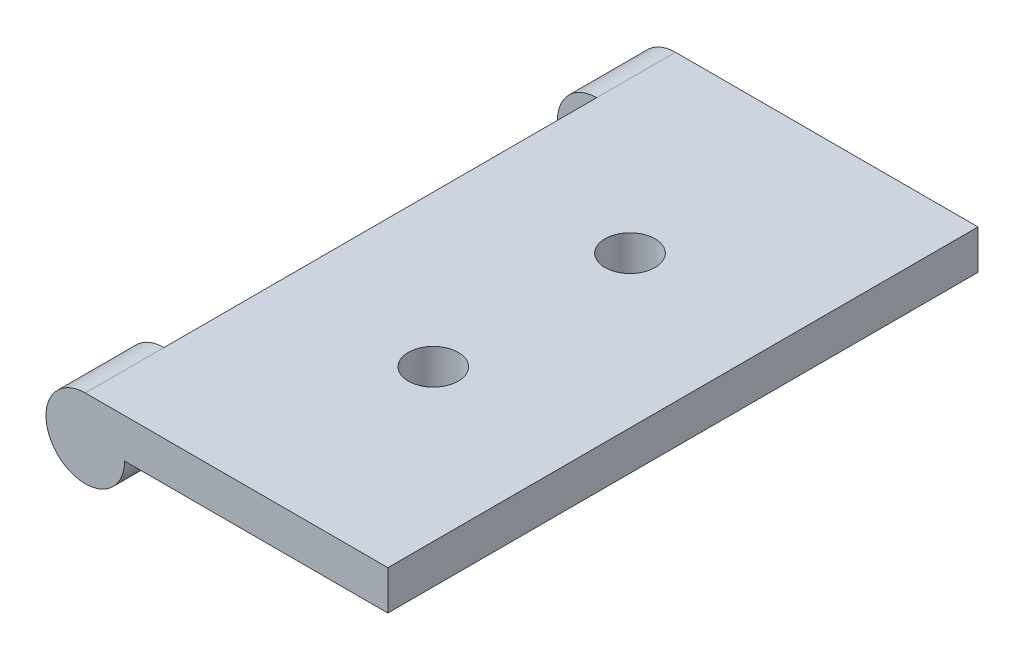
ISO-10303-21;
HEADER;
FILE_DESCRIPTION(('STEP AP214'),'2;1');
FILE_NAME('part.step','',(''),(''),'','','');
FILE_SCHEMA(('AUTOMOTIVE_DESIGN { 1 0 10303 214 1 1 1 1 }'));
ENDSEC;
DATA;
#1=APPLICATION_CONTEXT('core data for automotive mechanical design processes');
#2=APPLICATION_PROTOCOL_DEFINITION('international standard','automotive_design',2000,#1);
#3=PRODUCT_CONTEXT('',#1,'mechanical');
#4=PRODUCT('Part','Part','',(#3));
#5=PRODUCT_RELATED_PRODUCT_CATEGORY('part','',(#4));
#6=PRODUCT_DEFINITION_FORMATION('','',#4);
#7=PRODUCT_DEFINITION_CONTEXT('part definition',#1,'design');
#8=PRODUCT_DEFINITION('design','',#6,#7);
#9=PRODUCT_DEFINITION_SHAPE('','',#8);
#10=(LENGTH_UNIT() NAMED_UNIT(*) SI_UNIT(.MILLI.,.METRE.));
#11=(NAMED_UNIT(*) PLANE_ANGLE_UNIT() SI_UNIT($,.RADIAN.));
#12=(NAMED_UNIT(*) SI_UNIT($,.STERADIAN.) SOLID_ANGLE_UNIT());
#13=UNCERTAINTY_MEASURE_WITH_UNIT(LENGTH_MEASURE(1.E-05),#10,'distance_accuracy_value','');
#14=(GEOMETRIC_REPRESENTATION_CONTEXT(3) GLOBAL_UNCERTAINTY_ASSIGNED_CONTEXT((#13)) GLOBAL_UNIT_ASSIGNED_CONTEXT((#10,
#11,#12)) REPRESENTATION_CONTEXT('',''));
#15=CARTESIAN_POINT('',(0.,0.,0.));
#16=DIRECTION('',(0.,0.,1.));
#17=DIRECTION('',(1.,0.,0.));
#18=AXIS2_PLACEMENT_3D('',#15,#16,#17);
#19=CARTESIAN_POINT('',(44.2264973081033,0.,-75.));
#20=DIRECTION('',(0.,1.,0.));
#21=DIRECTION('',(-1.,0.,0.));
#22=AXIS2_PLACEMENT_3D('',#19,#20,#21);
#23=PLANE('',#22);
#24=CARTESIAN_POINT('',(25.,0.,-50.));
#25=DIRECTION('',(0.,1.,0.));
#26=DIRECTION('',(-1.,0.,0.));
#27=AXIS2_PLACEMENT_3D('',#24,#25,#26);
#28=CIRCLE('',#27,3.17500000000001);
#29=CARTESIAN_POINT('',(21.825,0.,-50.));
#30=VERTEX_POINT('',#29);
#31=EDGE_CURVE('E169',#30,#30,#28,.T.);
#32=ORIENTED_EDGE('',*,*,#31,.F.);
#33=EDGE_LOOP('',(#32));
#34=FACE_BOUND('',#33,.T.);
#35=CARTESIAN_POINT('',(25.,0.,-25.));
#36=DIRECTION('',(0.,1.,0.));
#37=DIRECTION('',(-1.,0.,0.));
#38=AXIS2_PLACEMENT_3D('',#35,#36,#37);
#39=CIRCLE('',#38,3.175);
#40=CARTESIAN_POINT('',(21.825,0.,-25.));
#41=VERTEX_POINT('',#40);
#42=EDGE_CURVE('E161',#41,#41,#39,.T.);
#43=ORIENTED_EDGE('',*,*,#42,.F.);
#44=EDGE_LOOP('',(#43));
#45=FACE_BOUND('',#44,.T.);
#46=DIRECTION('',(-1.,0.,0.));
#47=VECTOR('',#46,1.);
#48=CARTESIAN_POINT('',(44.2264973081033,0.,0.));
#49=LINE('',#48,#47);
#50=CARTESIAN_POINT('',(44.2264973081033,0.,0.));
#51=VERTEX_POINT('',#50);
#52=CARTESIAN_POINT('',(5.77350269189673,0.,0.));
#53=VERTEX_POINT('',#52);
#54=EDGE_CURVE('E131',#51,#53,#49,.T.);
#55=ORIENTED_EDGE('',*,*,#54,.F.);
#56=DIRECTION('',(0.,0.,1.));
#57=VECTOR('',#56,1.);
#58=CARTESIAN_POINT('',(44.2264973081033,0.,-75.));
#59=LINE('',#58,#57);
#60=CARTESIAN_POINT('',(44.2264973081033,0.,-75.));
#61=VERTEX_POINT('',#60);
#62=EDGE_CURVE('E144',#61,#51,#59,.T.);
#63=ORIENTED_EDGE('',*,*,#62,.F.);
#64=DIRECTION('',(-1.,0.,0.));
#65=VECTOR('',#64,1.);
#66=CARTESIAN_POINT('',(44.2264973081033,0.,-75.));
#67=LINE('',#66,#65);
#68=CARTESIAN_POINT('',(5.77350269189673,0.,-75.));
#69=VERTEX_POINT('',#68);
#70=EDGE_CURVE('E134',#61,#69,#67,.T.);
#71=ORIENTED_EDGE('',*,*,#70,.T.);
#72=DIRECTION('',(0.,0.,1.));
#73=VECTOR('',#72,1.);
#74=CARTESIAN_POINT('',(5.77350269189673,0.,-75.));
#75=LINE('',#74,#73);
#76=CARTESIAN_POINT('',(5.77350269189673,0.,-65.));
#77=VERTEX_POINT('',#76);
#78=EDGE_CURVE('E45',#69,#77,#75,.T.);
#79=ORIENTED_EDGE('',*,*,#78,.T.);
#80=CARTESIAN_POINT('',(5.77350269189673,0.,-10.));
#81=VERTEX_POINT('',#80);
#82=EDGE_CURVE('E93',#77,#81,#75,.T.);
#83=ORIENTED_EDGE('',*,*,#82,.T.);
#84=DIRECTION('',(0.,0.,1.));
#85=VECTOR('',#84,1.);
#86=CARTESIAN_POINT('',(5.77350269189673,0.,-9.99999999999998));
#87=LINE('',#86,#85);
#88=EDGE_CURVE('E121',#81,#53,#87,.T.);
#89=ORIENTED_EDGE('',*,*,#88,.T.);
#90=EDGE_LOOP('',(#55,#63,#71,#79,#83,#89));
#91=FACE_BOUND('',#90,.T.);
#92=ADVANCED_FACE('F37',(#34,#45,#91),#23,.T.);
#93=CARTESIAN_POINT('',(44.2264973081033,-5.,-75.));
#94=DIRECTION('',(1.,0.,0.));
#95=DIRECTION('',(0.,0.,-1.));
#96=AXIS2_PLACEMENT_3D('',#93,#94,#95);
#97=PLANE('',#96);
#98=DIRECTION('',(0.,1.,0.));
#99=VECTOR('',#98,1.);
#100=CARTESIAN_POINT('',(44.2264973081033,-5.,0.));
#101=LINE('',#100,#99);
#102=CARTESIAN_POINT('',(44.2264973081033,-5.,0.));
#103=VERTEX_POINT('',#102);
#104=EDGE_CURVE('E138',#103,#51,#101,.T.);
#105=ORIENTED_EDGE('',*,*,#104,.F.);
#106=DIRECTION('',(0.,0.,1.));
#107=VECTOR('',#106,1.);
#108=CARTESIAN_POINT('',(44.2264973081033,-5.,-75.));
#109=LINE('',#108,#107);
#110=CARTESIAN_POINT('',(44.2264973081033,-5.,-75.));
#111=VERTEX_POINT('',#110);
#112=EDGE_CURVE('E136',#111,#103,#109,.T.);
#113=ORIENTED_EDGE('',*,*,#112,.F.);
#114=DIRECTION('',(0.,1.,0.));
#115=VECTOR('',#114,1.);
#116=CARTESIAN_POINT('',(44.2264973081033,-5.,-75.));
#117=LINE('',#116,#115);
#118=EDGE_CURVE('E130',#111,#61,#117,.T.);
#119=ORIENTED_EDGE('',*,*,#118,.T.);
#120=ORIENTED_EDGE('',*,*,#62,.T.);
#121=EDGE_LOOP('',(#105,#113,#119,#120));
#122=FACE_BOUND('',#121,.T.);
#123=ADVANCED_FACE('F150',(#122),#97,.T.);
#124=CARTESIAN_POINT('',(5.77350269189673,-5.,-75.));
#125=DIRECTION('',(0.,-1.,0.));
#126=DIRECTION('',(1.,0.,0.));
#127=AXIS2_PLACEMENT_3D('',#124,#125,#126);
#128=PLANE('',#127);
#129=CARTESIAN_POINT('',(25.,-5.,-50.));
#130=DIRECTION('',(0.,-1.,0.));
#131=DIRECTION('',(1.,0.,0.));
#132=AXIS2_PLACEMENT_3D('',#129,#130,#131);
#133=CIRCLE('',#132,3.17500000000001);
#134=CARTESIAN_POINT('',(28.1750000000001,-5.,-50.));
#135=VERTEX_POINT('',#134);
#136=EDGE_CURVE('E172',#135,#135,#133,.T.);
#137=ORIENTED_EDGE('',*,*,#136,.F.);
#138=EDGE_LOOP('',(#137));
#139=FACE_BOUND('',#138,.T.);
#140=CARTESIAN_POINT('',(25.,-5.,-25.));
#141=DIRECTION('',(0.,-1.,0.));
#142=DIRECTION('',(1.,0.,0.));
#143=AXIS2_PLACEMENT_3D('',#140,#141,#142);
#144=CIRCLE('',#143,3.175);
#145=CARTESIAN_POINT('',(28.175,-5.,-25.));
#146=VERTEX_POINT('',#145);
#147=EDGE_CURVE('E164',#146,#146,#144,.T.);
#148=ORIENTED_EDGE('',*,*,#147,.F.);
#149=EDGE_LOOP('',(#148));
#150=FACE_BOUND('',#149,.T.);
#151=DIRECTION('',(0.,0.,1.));
#152=VECTOR('',#151,1.);
#153=CARTESIAN_POINT('',(10.7735026918967,-5.00000000000001,-65.));
#154=LINE('',#153,#152);
#155=CARTESIAN_POINT('',(10.7735026918967,-5.00000000000001,-65.));
#156=VERTEX_POINT('',#155);
#157=CARTESIAN_POINT('',(10.7735026918967,-5.00000000000001,-10.));
#158=VERTEX_POINT('',#157);
#159=EDGE_CURVE('E90',#156,#158,#154,.T.);
#160=ORIENTED_EDGE('',*,*,#159,.F.);
#161=DIRECTION('',(0.,0.,1.));
#162=VECTOR('',#161,1.);
#163=CARTESIAN_POINT('',(10.7735026918967,-5.00000000000001,-75.));
#164=LINE('',#163,#162);
#165=CARTESIAN_POINT('',(10.7735026918967,-5.,-75.));
#166=VERTEX_POINT('',#165);
#167=EDGE_CURVE('E59',#166,#156,#164,.T.);
#168=ORIENTED_EDGE('',*,*,#167,.F.);
#169=DIRECTION('',(1.,0.,0.));
#170=VECTOR('',#169,1.);
#171=CARTESIAN_POINT('',(5.77350269189673,-5.,-75.));
#172=LINE('',#171,#170);
#173=EDGE_CURVE('E128',#166,#111,#172,.T.);
#174=ORIENTED_EDGE('',*,*,#173,.T.);
#175=ORIENTED_EDGE('',*,*,#112,.T.);
#176=DIRECTION('',(1.,0.,0.));
#177=VECTOR('',#176,1.);
#178=CARTESIAN_POINT('',(5.77350269189673,-5.,0.));
#179=LINE('',#178,#177);
#180=CARTESIAN_POINT('',(10.7735026918967,-5.00000000000001,0.));
#181=VERTEX_POINT('',#180);
#182=EDGE_CURVE('E125',#181,#103,#179,.T.);
#183=ORIENTED_EDGE('',*,*,#182,.F.);
#184=DIRECTION('',(0.,0.,1.));
#185=VECTOR('',#184,1.);
#186=CARTESIAN_POINT('',(10.7735026918967,-5.00000000000001,-9.99999999999998));
#187=LINE('',#186,#185);
#188=EDGE_CURVE('E99',#158,#181,#187,.T.);
#189=ORIENTED_EDGE('',*,*,#188,.F.);
#190=EDGE_LOOP('',(#160,#168,#174,#175,#183,#189));
#191=FACE_BOUND('',#190,.T.);
#192=ADVANCED_FACE('F39',(#139,#150,#191),#128,.T.);
#193=CARTESIAN_POINT('',(5.77350269189673,-5.,-75.));
#194=DIRECTION('',(0.,0.,1.));
#195=DIRECTION('',(1.,0.,0.));
#196=AXIS2_PLACEMENT_3D('',#193,#194,#195);
#197=PLANE('',#196);
#198=ORIENTED_EDGE('',*,*,#173,.F.);
#199=CARTESIAN_POINT('',(5.77350269189674,-5.,-75.));
#200=DIRECTION('',(0.,0.,1.));
#201=DIRECTION('',(1.,0.,0.));
#202=AXIS2_PLACEMENT_3D('',#199,#200,#201);
#203=CIRCLE('',#202,5.);
#204=EDGE_CURVE('E109',#69,#166,#203,.T.);
#205=ORIENTED_EDGE('',*,*,#204,.F.);
#206=ORIENTED_EDGE('',*,*,#70,.F.);
#207=ORIENTED_EDGE('',*,*,#118,.F.);
#208=EDGE_LOOP('',(#198,#205,#206,#207));
#209=FACE_BOUND('',#208,.T.);
#210=ADVANCED_FACE('F180',(#209),#197,.F.);
#211=CARTESIAN_POINT('',(5.77350269189673,-5.,0.));
#212=DIRECTION('',(0.,0.,1.));
#213=DIRECTION('',(1.,0.,0.));
#214=AXIS2_PLACEMENT_3D('',#211,#212,#213);
#215=PLANE('',#214);
#216=CARTESIAN_POINT('',(5.77350269189674,-5.,0.));
#217=DIRECTION('',(0.,0.,1.));
#218=DIRECTION('',(1.,0.,0.));
#219=AXIS2_PLACEMENT_3D('',#216,#217,#218);
#220=CIRCLE('',#219,5.);
#221=EDGE_CURVE('E110',#53,#181,#220,.T.);
#222=ORIENTED_EDGE('',*,*,#221,.T.);
#223=ORIENTED_EDGE('',*,*,#182,.T.);
#224=ORIENTED_EDGE('',*,*,#104,.T.);
#225=ORIENTED_EDGE('',*,*,#54,.T.);
#226=EDGE_LOOP('',(#222,#223,#224,#225));
#227=FACE_BOUND('',#226,.T.);
#228=ADVANCED_FACE('F153',(#227),#215,.T.);
#229=CARTESIAN_POINT('',(5.77350269189674,-5.,-9.99999999999998));
#230=DIRECTION('',(0.,0.,1.));
#231=DIRECTION('',(1.,0.,0.));
#232=AXIS2_PLACEMENT_3D('',#229,#230,#231);
#233=CYLINDRICAL_SURFACE('',#232,5.);
#234=ORIENTED_EDGE('',*,*,#221,.F.);
#235=ORIENTED_EDGE('',*,*,#88,.F.);
#236=CARTESIAN_POINT('',(5.77350269189674,-5.,-9.99999999999998));
#237=DIRECTION('',(0.,0.,1.));
#238=DIRECTION('',(1.,0.,0.));
#239=AXIS2_PLACEMENT_3D('',#236,#237,#238);
#240=CIRCLE('',#239,5.);
#241=EDGE_CURVE('E118',#81,#158,#240,.T.);
#242=ORIENTED_EDGE('',*,*,#241,.T.);
#243=ORIENTED_EDGE('',*,*,#188,.T.);
#244=EDGE_LOOP('',(#234,#235,#242,#243));
#245=FACE_BOUND('',#244,.T.);
#246=ADVANCED_FACE('F158',(#245),#233,.T.);
#247=CARTESIAN_POINT('',(58.6754727752881,-369.292878629585,-9.99999999999998));
#248=DIRECTION('',(0.,0.,1.));
#249=DIRECTION('',(1.,0.,0.));
#250=AXIS2_PLACEMENT_3D('',#247,#248,#249);
#251=PLANE('',#250);
#252=CARTESIAN_POINT('',(5.77350269189673,-5.,-9.99999999999998));
#253=DIRECTION('',(0.,0.,1.));
#254=DIRECTION('',(1.,0.,0.));
#255=AXIS2_PLACEMENT_3D('',#252,#253,#254);
#256=CIRCLE('',#255,2.5);
#257=CARTESIAN_POINT('',(8.27350269189673,-5.,-9.99999999999998));
#258=VERTEX_POINT('',#257);
#259=EDGE_CURVE('E11',#258,#258,#256,.T.);
#260=ORIENTED_EDGE('',*,*,#259,.T.);
#261=EDGE_LOOP('',(#260));
#262=FACE_BOUND('',#261,.T.);
#263=ORIENTED_EDGE('',*,*,#241,.F.);
#264=CARTESIAN_POINT('',(5.77350269189674,-5.,-10.));
#265=DIRECTION('',(0.,0.,1.));
#266=DIRECTION('',(1.,0.,0.));
#267=AXIS2_PLACEMENT_3D('',#264,#265,#266);
#268=CIRCLE('',#267,5.);
#269=EDGE_CURVE('E95',#158,#81,#268,.T.);
#270=ORIENTED_EDGE('',*,*,#269,.F.);
#271=EDGE_LOOP('',(#263,#270));
#272=FACE_BOUND('',#271,.T.);
#273=ADVANCED_FACE('F160',(#262,#272),#251,.F.);
#274=CARTESIAN_POINT('',(5.77350269189673,-5.,-75.));
#275=DIRECTION('',(0.,0.,1.));
#276=DIRECTION('',(1.,0.,0.));
#277=AXIS2_PLACEMENT_3D('',#274,#275,#276);
#278=CYLINDRICAL_SURFACE('',#277,2.5);
#279=ORIENTED_EDGE('',*,*,#259,.F.);
#280=EDGE_LOOP('',(#279));
#281=FACE_BOUND('',#280,.T.);
#282=CARTESIAN_POINT('',(5.77350269189673,-5.,-65.));
#283=DIRECTION('',(0.,0.,1.));
#284=DIRECTION('',(1.,0.,0.));
#285=AXIS2_PLACEMENT_3D('',#282,#283,#284);
#286=CIRCLE('',#285,2.5);
#287=CARTESIAN_POINT('',(8.27350269189673,-5.,-65.));
#288=VERTEX_POINT('',#287);
#289=EDGE_CURVE('E100',#288,#288,#286,.T.);
#290=ORIENTED_EDGE('',*,*,#289,.T.);
#291=EDGE_LOOP('',(#290));
#292=FACE_BOUND('',#291,.T.);
#293=ADVANCED_FACE('F212',(#281,#292),#278,.T.);
#294=CARTESIAN_POINT('',(5.77350269189674,-5.,-75.));
#295=DIRECTION('',(0.,0.,1.));
#296=DIRECTION('',(1.,0.,0.));
#297=AXIS2_PLACEMENT_3D('',#294,#295,#296);
#298=CYLINDRICAL_SURFACE('',#297,5.);
#299=CARTESIAN_POINT('',(5.77350269189674,-5.,-65.));
#300=DIRECTION('',(0.,0.,1.));
#301=DIRECTION('',(1.,0.,0.));
#302=AXIS2_PLACEMENT_3D('',#299,#300,#301);
#303=CIRCLE('',#302,5.);
#304=EDGE_CURVE('E107',#77,#156,#303,.T.);
#305=ORIENTED_EDGE('',*,*,#304,.F.);
#306=ORIENTED_EDGE('',*,*,#78,.F.);
#307=ORIENTED_EDGE('',*,*,#204,.T.);
#308=ORIENTED_EDGE('',*,*,#167,.T.);
#309=EDGE_LOOP('',(#305,#306,#307,#308));
#310=FACE_BOUND('',#309,.T.);
#311=ADVANCED_FACE('F105',(#310),#298,.T.);
#312=CARTESIAN_POINT('',(58.6754727752881,-369.292878629585,-65.));
#313=DIRECTION('',(0.,0.,1.));
#314=DIRECTION('',(1.,0.,0.));
#315=AXIS2_PLACEMENT_3D('',#312,#313,#314);
#316=PLANE('',#315);
#317=ORIENTED_EDGE('',*,*,#289,.F.);
#318=EDGE_LOOP('',(#317));
#319=FACE_BOUND('',#318,.T.);
#320=CARTESIAN_POINT('',(5.77350269189674,-5.,-65.));
#321=DIRECTION('',(0.,0.,1.));
#322=DIRECTION('',(1.,0.,0.));
#323=AXIS2_PLACEMENT_3D('',#320,#321,#322);
#324=CIRCLE('',#323,5.);
#325=EDGE_CURVE('E51',#156,#77,#324,.T.);
#326=ORIENTED_EDGE('',*,*,#325,.T.);
#327=ORIENTED_EDGE('',*,*,#304,.T.);
#328=EDGE_LOOP('',(#326,#327));
#329=FACE_BOUND('',#328,.T.);
#330=ADVANCED_FACE('F112',(#319,#329),#316,.T.);
#331=CARTESIAN_POINT('',(5.77350269189674,-5.,-65.));
#332=DIRECTION('',(0.,0.,1.));
#333=DIRECTION('',(1.,0.,0.));
#334=AXIS2_PLACEMENT_3D('',#331,#332,#333);
#335=CYLINDRICAL_SURFACE('',#334,5.);
#336=ORIENTED_EDGE('',*,*,#269,.T.);
#337=ORIENTED_EDGE('',*,*,#82,.F.);
#338=ORIENTED_EDGE('',*,*,#325,.F.);
#339=ORIENTED_EDGE('',*,*,#159,.T.);
#340=EDGE_LOOP('',(#336,#337,#338,#339));
#341=FACE_BOUND('',#340,.T.);
#342=ADVANCED_FACE('F89',(#341),#335,.F.);
#343=CARTESIAN_POINT('',(25.,50.,-25.));
#344=DIRECTION('',(0.,-1.,0.));
#345=DIRECTION('',(1.,0.,0.));
#346=AXIS2_PLACEMENT_3D('',#343,#344,#345);
#347=CYLINDRICAL_SURFACE('',#346,3.175);
#348=ORIENTED_EDGE('',*,*,#42,.T.);
#349=EDGE_LOOP('',(#348));
#350=FACE_BOUND('',#349,.T.);
#351=ORIENTED_EDGE('',*,*,#147,.T.);
#352=EDGE_LOOP('',(#351));
#353=FACE_BOUND('',#352,.T.);
#354=ADVANCED_FACE('F183',(#350,#353),#347,.F.);
#355=CARTESIAN_POINT('',(25.,50.,-50.));
#356=DIRECTION('',(0.,-1.,0.));
#357=DIRECTION('',(1.,0.,0.));
#358=AXIS2_PLACEMENT_3D('',#355,#356,#357);
#359=CYLINDRICAL_SURFACE('',#358,3.17500000000001);
#360=ORIENTED_EDGE('',*,*,#31,.T.);
#361=EDGE_LOOP('',(#360));
#362=FACE_BOUND('',#361,.T.);
#363=ORIENTED_EDGE('',*,*,#136,.T.);
#364=EDGE_LOOP('',(#363));
#365=FACE_BOUND('',#364,.T.);
#366=ADVANCED_FACE('F176',(#362,#365),#359,.F.);
#367=CLOSED_SHELL('',(#92,#123,#192,#210,#228,#246,#273,#293,#311,#330,#342,#354,#366));
#368=MANIFOLD_SOLID_BREP('B2',#367);
#369=ADVANCED_BREP_SHAPE_REPRESENTATION('',(#18,#368),#14);
#370=SHAPE_DEFINITION_REPRESENTATION(#9,#369);
ENDSEC;
END-ISO-10303-21;
